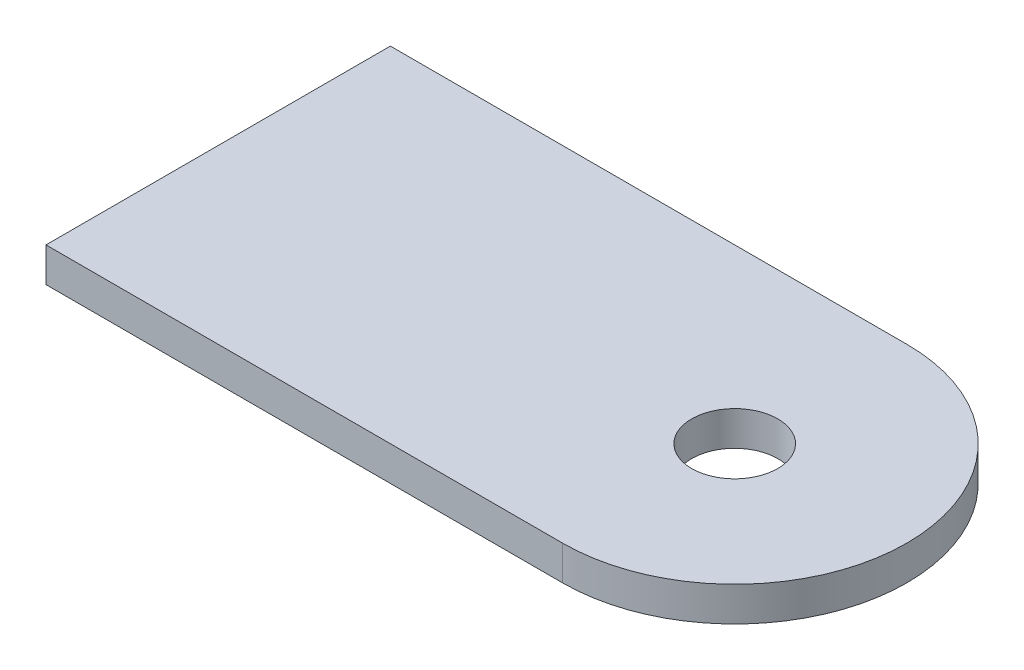
ISO-10303-21;
HEADER;
FILE_DESCRIPTION(('STEP AP214'),'2;1');
FILE_NAME('part.step','',(''),(''),'','','');
FILE_SCHEMA(('AUTOMOTIVE_DESIGN { 1 0 10303 214 1 1 1 1 }'));
ENDSEC;
DATA;
#1=APPLICATION_CONTEXT('core data for automotive mechanical design processes');
#2=APPLICATION_PROTOCOL_DEFINITION('international standard','automotive_design',2000,#1);
#3=PRODUCT_CONTEXT('',#1,'mechanical');
#4=PRODUCT('Part','Part','',(#3));
#5=PRODUCT_RELATED_PRODUCT_CATEGORY('part','',(#4));
#6=PRODUCT_DEFINITION_FORMATION('','',#4);
#7=PRODUCT_DEFINITION_CONTEXT('part definition',#1,'design');
#8=PRODUCT_DEFINITION('design','',#6,#7);
#9=PRODUCT_DEFINITION_SHAPE('','',#8);
#10=(LENGTH_UNIT() NAMED_UNIT(*) SI_UNIT(.MILLI.,.METRE.));
#11=(NAMED_UNIT(*) PLANE_ANGLE_UNIT() SI_UNIT($,.RADIAN.));
#12=(NAMED_UNIT(*) SI_UNIT($,.STERADIAN.) SOLID_ANGLE_UNIT());
#13=UNCERTAINTY_MEASURE_WITH_UNIT(LENGTH_MEASURE(1.E-05),#10,'distance_accuracy_value','');
#14=(GEOMETRIC_REPRESENTATION_CONTEXT(3) GLOBAL_UNCERTAINTY_ASSIGNED_CONTEXT((#13)) GLOBAL_UNIT_ASSIGNED_CONTEXT((#10,
#11,#12)) REPRESENTATION_CONTEXT('',''));
#15=CARTESIAN_POINT('',(0.,0.,0.));
#16=DIRECTION('',(0.,0.,1.));
#17=DIRECTION('',(1.,0.,0.));
#18=AXIS2_PLACEMENT_3D('',#15,#16,#17);
#19=CARTESIAN_POINT('',(60.,4.,-20.));
#20=DIRECTION('',(0.,-1.,0.));
#21=DIRECTION('',(0.,0.,-1.));
#22=AXIS2_PLACEMENT_3D('',#19,#20,#21);
#23=CYLINDRICAL_SURFACE('',#22,20.);
#24=CARTESIAN_POINT('',(60.,0.,-20.));
#25=DIRECTION('',(0.,1.,0.));
#26=DIRECTION('',(0.,0.,1.));
#27=AXIS2_PLACEMENT_3D('',#24,#25,#26);
#28=CIRCLE('',#27,20.);
#29=CARTESIAN_POINT('',(60.,0.,-40.));
#30=VERTEX_POINT('',#29);
#31=CARTESIAN_POINT('',(60.,0.,0.));
#32=VERTEX_POINT('',#31);
#33=EDGE_CURVE('E100',#30,#32,#28,.F.);
#34=ORIENTED_EDGE('',*,*,#33,.F.);
#35=DIRECTION('',(0.,-1.,0.));
#36=VECTOR('',#35,1.);
#37=CARTESIAN_POINT('',(60.,4.,-40.));
#38=LINE('',#37,#36);
#39=CARTESIAN_POINT('',(60.,4.,-40.));
#40=VERTEX_POINT('',#39);
#41=EDGE_CURVE('E11',#40,#30,#38,.T.);
#42=ORIENTED_EDGE('',*,*,#41,.F.);
#43=CARTESIAN_POINT('',(60.,4.,-20.));
#44=DIRECTION('',(0.,1.,0.));
#45=DIRECTION('',(0.,0.,1.));
#46=AXIS2_PLACEMENT_3D('',#43,#44,#45);
#47=CIRCLE('',#46,20.);
#48=CARTESIAN_POINT('',(60.,4.,0.));
#49=VERTEX_POINT('',#48);
#50=EDGE_CURVE('E90',#40,#49,#47,.F.);
#51=ORIENTED_EDGE('',*,*,#50,.T.);
#52=DIRECTION('',(0.,-1.,0.));
#53=VECTOR('',#52,1.);
#54=CARTESIAN_POINT('',(60.,4.,0.));
#55=LINE('',#54,#53);
#56=EDGE_CURVE('E71',#49,#32,#55,.T.);
#57=ORIENTED_EDGE('',*,*,#56,.T.);
#58=EDGE_LOOP('',(#34,#42,#51,#57));
#59=FACE_BOUND('',#58,.T.);
#60=ADVANCED_FACE('F33',(#59),#23,.T.);
#61=CARTESIAN_POINT('',(0.,4.,-40.));
#62=DIRECTION('',(0.,0.,-1.));
#63=DIRECTION('',(-1.,0.,0.));
#64=AXIS2_PLACEMENT_3D('',#61,#62,#63);
#65=PLANE('',#64);
#66=DIRECTION('',(1.,0.,0.));
#67=VECTOR('',#66,1.);
#68=CARTESIAN_POINT('',(0.,0.,-40.));
#69=LINE('',#68,#67);
#70=CARTESIAN_POINT('',(0.,0.,-40.));
#71=VERTEX_POINT('',#70);
#72=EDGE_CURVE('E82',#71,#30,#69,.T.);
#73=ORIENTED_EDGE('',*,*,#72,.F.);
#74=DIRECTION('',(0.,-1.,0.));
#75=VECTOR('',#74,1.);
#76=CARTESIAN_POINT('',(0.,4.,-40.));
#77=LINE('',#76,#75);
#78=CARTESIAN_POINT('',(0.,4.,-40.));
#79=VERTEX_POINT('',#78);
#80=EDGE_CURVE('E41',#79,#71,#77,.T.);
#81=ORIENTED_EDGE('',*,*,#80,.F.);
#82=DIRECTION('',(1.,0.,0.));
#83=VECTOR('',#82,1.);
#84=CARTESIAN_POINT('',(0.,4.,-40.));
#85=LINE('',#84,#83);
#86=EDGE_CURVE('E80',#79,#40,#85,.T.);
#87=ORIENTED_EDGE('',*,*,#86,.T.);
#88=ORIENTED_EDGE('',*,*,#41,.T.);
#89=EDGE_LOOP('',(#73,#81,#87,#88));
#90=FACE_BOUND('',#89,.T.);
#91=ADVANCED_FACE('F79',(#90),#65,.T.);
#92=CARTESIAN_POINT('',(0.,4.,0.));
#93=DIRECTION('',(-1.,0.,0.));
#94=DIRECTION('',(0.,0.,1.));
#95=AXIS2_PLACEMENT_3D('',#92,#93,#94);
#96=PLANE('',#95);
#97=DIRECTION('',(0.,0.,-1.));
#98=VECTOR('',#97,1.);
#99=CARTESIAN_POINT('',(0.,0.,0.));
#100=LINE('',#99,#98);
#101=CARTESIAN_POINT('',(0.,0.,0.));
#102=VERTEX_POINT('',#101);
#103=EDGE_CURVE('E104',#102,#71,#100,.T.);
#104=ORIENTED_EDGE('',*,*,#103,.F.);
#105=DIRECTION('',(0.,-1.,0.));
#106=VECTOR('',#105,1.);
#107=CARTESIAN_POINT('',(0.,4.,0.));
#108=LINE('',#107,#106);
#109=CARTESIAN_POINT('',(0.,4.,0.));
#110=VERTEX_POINT('',#109);
#111=EDGE_CURVE('E64',#110,#102,#108,.T.);
#112=ORIENTED_EDGE('',*,*,#111,.F.);
#113=DIRECTION('',(0.,0.,-1.));
#114=VECTOR('',#113,1.);
#115=CARTESIAN_POINT('',(0.,4.,0.));
#116=LINE('',#115,#114);
#117=EDGE_CURVE('E89',#110,#79,#116,.T.);
#118=ORIENTED_EDGE('',*,*,#117,.T.);
#119=ORIENTED_EDGE('',*,*,#80,.T.);
#120=EDGE_LOOP('',(#104,#112,#118,#119));
#121=FACE_BOUND('',#120,.T.);
#122=ADVANCED_FACE('F92',(#121),#96,.T.);
#123=CARTESIAN_POINT('',(0.,4.,0.));
#124=DIRECTION('',(0.,0.,-1.));
#125=DIRECTION('',(-1.,0.,0.));
#126=AXIS2_PLACEMENT_3D('',#123,#124,#125);
#127=PLANE('',#126);
#128=DIRECTION('',(1.,0.,0.));
#129=VECTOR('',#128,1.);
#130=CARTESIAN_POINT('',(0.,0.,0.));
#131=LINE('',#130,#129);
#132=EDGE_CURVE('E106',#102,#32,#131,.T.);
#133=ORIENTED_EDGE('',*,*,#132,.T.);
#134=ORIENTED_EDGE('',*,*,#56,.F.);
#135=DIRECTION('',(1.,0.,0.));
#136=VECTOR('',#135,1.);
#137=CARTESIAN_POINT('',(0.,4.,0.));
#138=LINE('',#137,#136);
#139=EDGE_CURVE('E49',#110,#49,#138,.T.);
#140=ORIENTED_EDGE('',*,*,#139,.F.);
#141=ORIENTED_EDGE('',*,*,#111,.T.);
#142=EDGE_LOOP('',(#133,#134,#140,#141));
#143=FACE_BOUND('',#142,.T.);
#144=ADVANCED_FACE('F121',(#143),#127,.F.);
#145=CARTESIAN_POINT('',(60.,4.,-20.));
#146=DIRECTION('',(0.,-1.,0.));
#147=DIRECTION('',(0.,0.,-1.));
#148=AXIS2_PLACEMENT_3D('',#145,#146,#147);
#149=CYLINDRICAL_SURFACE('',#148,5.);
#150=CARTESIAN_POINT('',(60.,4.,-20.));
#151=DIRECTION('',(0.,1.,0.));
#152=DIRECTION('',(0.,0.,1.));
#153=AXIS2_PLACEMENT_3D('',#150,#151,#152);
#154=CIRCLE('',#153,5.);
#155=CARTESIAN_POINT('',(60.,4.,-15.));
#156=VERTEX_POINT('',#155);
#157=EDGE_CURVE('E94',#156,#156,#154,.T.);
#158=ORIENTED_EDGE('',*,*,#157,.T.);
#159=EDGE_LOOP('',(#158));
#160=FACE_BOUND('',#159,.T.);
#161=CARTESIAN_POINT('',(60.,0.,-20.));
#162=DIRECTION('',(0.,1.,0.));
#163=DIRECTION('',(0.,0.,1.));
#164=AXIS2_PLACEMENT_3D('',#161,#162,#163);
#165=CIRCLE('',#164,5.);
#166=CARTESIAN_POINT('',(60.,0.,-15.));
#167=VERTEX_POINT('',#166);
#168=EDGE_CURVE('E108',#167,#167,#165,.T.);
#169=ORIENTED_EDGE('',*,*,#168,.F.);
#170=EDGE_LOOP('',(#169));
#171=FACE_BOUND('',#170,.T.);
#172=ADVANCED_FACE('F126',(#160,#171),#149,.F.);
#173=CARTESIAN_POINT('',(0.,4.,0.));
#174=DIRECTION('',(0.,1.,0.));
#175=DIRECTION('',(0.,0.,1.));
#176=AXIS2_PLACEMENT_3D('',#173,#174,#175);
#177=PLANE('',#176);
#178=ORIENTED_EDGE('',*,*,#50,.F.);
#179=ORIENTED_EDGE('',*,*,#86,.F.);
#180=ORIENTED_EDGE('',*,*,#117,.F.);
#181=ORIENTED_EDGE('',*,*,#139,.T.);
#182=EDGE_LOOP('',(#178,#179,#180,#181));
#183=FACE_BOUND('',#182,.T.);
#184=ORIENTED_EDGE('',*,*,#157,.F.);
#185=EDGE_LOOP('',(#184));
#186=FACE_BOUND('',#185,.T.);
#187=ADVANCED_FACE('F87',(#183,#186),#177,.T.);
#188=CARTESIAN_POINT('',(0.,0.,0.));
#189=DIRECTION('',(0.,1.,0.));
#190=DIRECTION('',(0.,0.,1.));
#191=AXIS2_PLACEMENT_3D('',#188,#189,#190);
#192=PLANE('',#191);
#193=ORIENTED_EDGE('',*,*,#33,.T.);
#194=ORIENTED_EDGE('',*,*,#132,.F.);
#195=ORIENTED_EDGE('',*,*,#103,.T.);
#196=ORIENTED_EDGE('',*,*,#72,.T.);
#197=EDGE_LOOP('',(#193,#194,#195,#196));
#198=FACE_BOUND('',#197,.T.);
#199=ORIENTED_EDGE('',*,*,#168,.T.);
#200=EDGE_LOOP('',(#199));
#201=FACE_BOUND('',#200,.T.);
#202=ADVANCED_FACE('F130',(#198,#201),#192,.F.);
#203=CLOSED_SHELL('',(#60,#91,#122,#144,#172,#187,#202));
#204=MANIFOLD_SOLID_BREP('B2',#203);
#205=ADVANCED_BREP_SHAPE_REPRESENTATION('',(#18,#204),#14);
#206=SHAPE_DEFINITION_REPRESENTATION(#9,#205);
ENDSEC;
END-ISO-10303-21;
